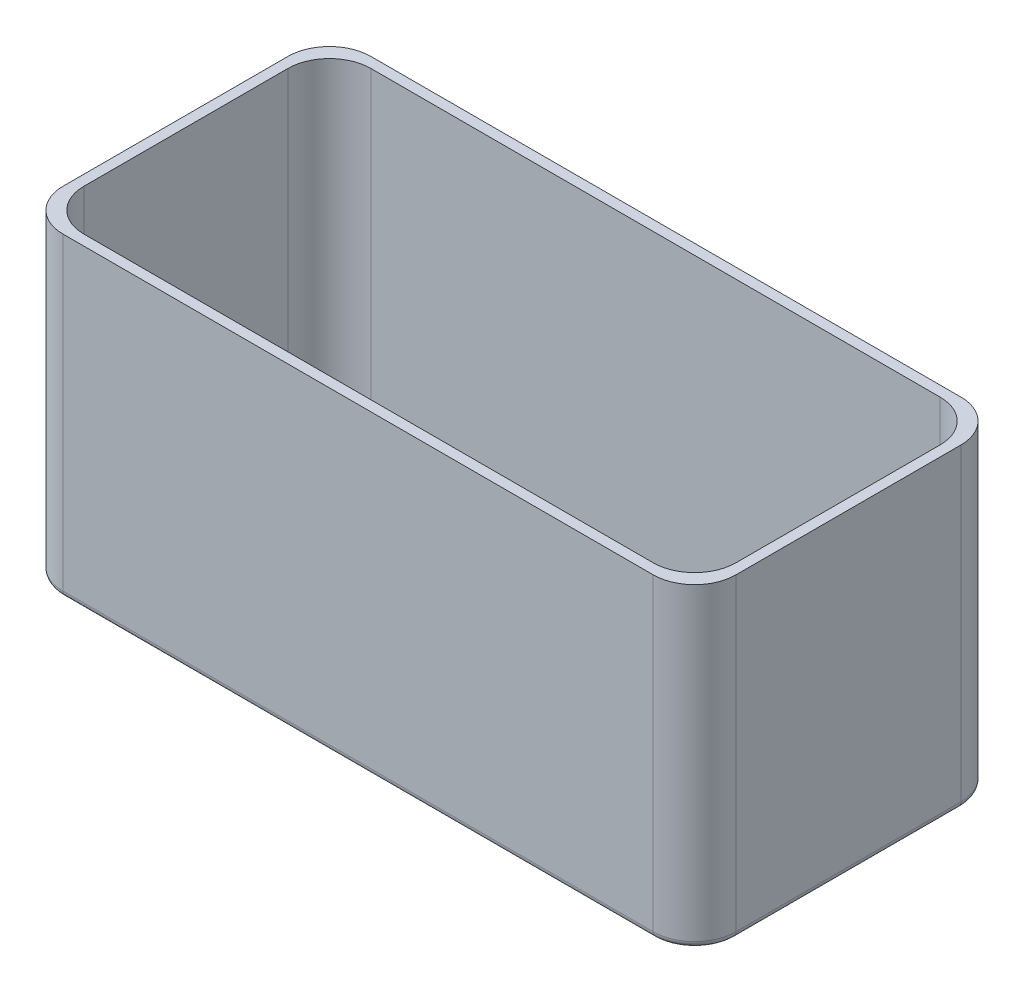
ISO-10303-21;
HEADER;
FILE_DESCRIPTION(('STEP AP214'),'2;1');
FILE_NAME('part.step','',(''),(''),'','','');
FILE_SCHEMA(('AUTOMOTIVE_DESIGN { 1 0 10303 214 1 1 1 1 }'));
ENDSEC;
DATA;
#1=APPLICATION_CONTEXT('core data for automotive mechanical design processes');
#2=APPLICATION_PROTOCOL_DEFINITION('international standard','automotive_design',2000,#1);
#3=PRODUCT_CONTEXT('',#1,'mechanical');
#4=PRODUCT('Part','Part','',(#3));
#5=PRODUCT_RELATED_PRODUCT_CATEGORY('part','',(#4));
#6=PRODUCT_DEFINITION_FORMATION('','',#4);
#7=PRODUCT_DEFINITION_CONTEXT('part definition',#1,'design');
#8=PRODUCT_DEFINITION('design','',#6,#7);
#9=PRODUCT_DEFINITION_SHAPE('','',#8);
#10=(LENGTH_UNIT() NAMED_UNIT(*) SI_UNIT(.MILLI.,.METRE.));
#11=(NAMED_UNIT(*) PLANE_ANGLE_UNIT() SI_UNIT($,.RADIAN.));
#12=(NAMED_UNIT(*) SI_UNIT($,.STERADIAN.) SOLID_ANGLE_UNIT());
#13=UNCERTAINTY_MEASURE_WITH_UNIT(LENGTH_MEASURE(1.E-05),#10,'distance_accuracy_value','');
#14=(GEOMETRIC_REPRESENTATION_CONTEXT(3) GLOBAL_UNCERTAINTY_ASSIGNED_CONTEXT((#13)) GLOBAL_UNIT_ASSIGNED_CONTEXT((#10,
#11,#12)) REPRESENTATION_CONTEXT('',''));
#15=CARTESIAN_POINT('',(0.,0.,0.));
#16=DIRECTION('',(0.,0.,1.));
#17=DIRECTION('',(1.,0.,0.));
#18=AXIS2_PLACEMENT_3D('',#15,#16,#17);
#19=CARTESIAN_POINT('',(0.,24.2,0.));
#20=DIRECTION('',(0.,-1.,0.));
#21=DIRECTION('',(0.,0.,-1.));
#22=AXIS2_PLACEMENT_3D('',#19,#20,#21);
#23=PLANE('',#22);
#24=DIRECTION('',(1.,0.,0.));
#25=VECTOR('',#24,1.);
#26=CARTESIAN_POINT('',(25.8,24.2,11.8));
#27=LINE('',#26,#25);
#28=CARTESIAN_POINT('',(-22.62,24.2,11.8));
#29=VERTEX_POINT('',#28);
#30=CARTESIAN_POINT('',(22.62,24.2,11.8));
#31=VERTEX_POINT('',#30);
#32=EDGE_CURVE('E211',#29,#31,#27,.T.);
#33=ORIENTED_EDGE('',*,*,#32,.T.);
#34=CARTESIAN_POINT('',(22.62,24.2,8.62));
#35=DIRECTION('',(0.,-1.,0.));
#36=DIRECTION('',(0.,0.,-1.));
#37=AXIS2_PLACEMENT_3D('',#34,#35,#36);
#38=CIRCLE('',#37,3.18);
#39=CARTESIAN_POINT('',(25.8,24.2,8.62));
#40=VERTEX_POINT('',#39);
#41=EDGE_CURVE('E205',#31,#40,#38,.F.);
#42=ORIENTED_EDGE('',*,*,#41,.T.);
#43=DIRECTION('',(0.,0.,-1.));
#44=VECTOR('',#43,1.);
#45=CARTESIAN_POINT('',(25.8,24.2,-11.8));
#46=LINE('',#45,#44);
#47=CARTESIAN_POINT('',(25.8,24.2,-8.62));
#48=VERTEX_POINT('',#47);
#49=EDGE_CURVE('E208',#40,#48,#46,.T.);
#50=ORIENTED_EDGE('',*,*,#49,.T.);
#51=CARTESIAN_POINT('',(22.62,24.2,-8.62));
#52=DIRECTION('',(0.,-1.,0.));
#53=DIRECTION('',(0.,0.,-1.));
#54=AXIS2_PLACEMENT_3D('',#51,#52,#53);
#55=CIRCLE('',#54,3.18);
#56=CARTESIAN_POINT('',(22.62,24.2,-11.8));
#57=VERTEX_POINT('',#56);
#58=EDGE_CURVE('E217',#48,#57,#55,.F.);
#59=ORIENTED_EDGE('',*,*,#58,.T.);
#60=DIRECTION('',(-1.,0.,0.));
#61=VECTOR('',#60,1.);
#62=CARTESIAN_POINT('',(25.8,24.2,-11.8));
#63=LINE('',#62,#61);
#64=CARTESIAN_POINT('',(-22.62,24.2,-11.8));
#65=VERTEX_POINT('',#64);
#66=EDGE_CURVE('E227',#57,#65,#63,.T.);
#67=ORIENTED_EDGE('',*,*,#66,.T.);
#68=CARTESIAN_POINT('',(-22.62,24.2,-8.62));
#69=DIRECTION('',(0.,-1.,0.));
#70=DIRECTION('',(0.,0.,-1.));
#71=AXIS2_PLACEMENT_3D('',#68,#69,#70);
#72=CIRCLE('',#71,3.18);
#73=CARTESIAN_POINT('',(-25.8,24.2,-8.62));
#74=VERTEX_POINT('',#73);
#75=EDGE_CURVE('E298',#65,#74,#72,.F.);
#76=ORIENTED_EDGE('',*,*,#75,.T.);
#77=DIRECTION('',(0.,0.,1.));
#78=VECTOR('',#77,1.);
#79=CARTESIAN_POINT('',(-25.8,24.2,-11.8));
#80=LINE('',#79,#78);
#81=CARTESIAN_POINT('',(-25.8,24.2,8.62));
#82=VERTEX_POINT('',#81);
#83=EDGE_CURVE('E493',#74,#82,#80,.T.);
#84=ORIENTED_EDGE('',*,*,#83,.T.);
#85=CARTESIAN_POINT('',(-22.62,24.2,8.62));
#86=DIRECTION('',(0.,-1.,0.));
#87=DIRECTION('',(0.,0.,-1.));
#88=AXIS2_PLACEMENT_3D('',#85,#86,#87);
#89=CIRCLE('',#88,3.18);
#90=EDGE_CURVE('E301',#82,#29,#89,.F.);
#91=ORIENTED_EDGE('',*,*,#90,.T.);
#92=EDGE_LOOP('',(#33,#42,#50,#59,#67,#76,#84,#91));
#93=FACE_BOUND('',#92,.T.);
#94=DIRECTION('',(0.,0.,1.));
#95=VECTOR('',#94,1.);
#96=CARTESIAN_POINT('',(-25.,24.2,-11.));
#97=LINE('',#96,#95);
#98=CARTESIAN_POINT('',(-25.,24.2,-7.81999999999999));
#99=VERTEX_POINT('',#98);
#100=CARTESIAN_POINT('',(-25.,24.2,7.82));
#101=VERTEX_POINT('',#100);
#102=EDGE_CURVE('E428',#99,#101,#97,.T.);
#103=ORIENTED_EDGE('',*,*,#102,.F.);
#104=CARTESIAN_POINT('',(-21.82,24.2,-7.81999999999999));
#105=DIRECTION('',(0.,-1.,0.));
#106=DIRECTION('',(0.,0.,-1.));
#107=AXIS2_PLACEMENT_3D('',#104,#105,#106);
#108=CIRCLE('',#107,3.18);
#109=CARTESIAN_POINT('',(-21.82,24.2,-11.));
#110=VERTEX_POINT('',#109);
#111=EDGE_CURVE('E292',#99,#110,#108,.T.);
#112=ORIENTED_EDGE('',*,*,#111,.T.);
#113=DIRECTION('',(-1.,0.,0.));
#114=VECTOR('',#113,1.);
#115=CARTESIAN_POINT('',(25.,24.2,-11.));
#116=LINE('',#115,#114);
#117=CARTESIAN_POINT('',(21.82,24.2,-11.));
#118=VERTEX_POINT('',#117);
#119=EDGE_CURVE('E228',#118,#110,#116,.T.);
#120=ORIENTED_EDGE('',*,*,#119,.F.);
#121=CARTESIAN_POINT('',(21.82,24.2,-7.82));
#122=DIRECTION('',(0.,-1.,0.));
#123=DIRECTION('',(0.,0.,-1.));
#124=AXIS2_PLACEMENT_3D('',#121,#122,#123);
#125=CIRCLE('',#124,3.18);
#126=CARTESIAN_POINT('',(25.,24.2,-7.82));
#127=VERTEX_POINT('',#126);
#128=EDGE_CURVE('E286',#118,#127,#125,.T.);
#129=ORIENTED_EDGE('',*,*,#128,.T.);
#130=DIRECTION('',(0.,0.,-1.));
#131=VECTOR('',#130,1.);
#132=CARTESIAN_POINT('',(25.,24.2,-11.));
#133=LINE('',#132,#131);
#134=CARTESIAN_POINT('',(25.,24.2,7.81999999999999));
#135=VERTEX_POINT('',#134);
#136=EDGE_CURVE('E478',#135,#127,#133,.T.);
#137=ORIENTED_EDGE('',*,*,#136,.F.);
#138=CARTESIAN_POINT('',(21.82,24.2,7.81999999999999));
#139=DIRECTION('',(0.,-1.,0.));
#140=DIRECTION('',(0.,0.,-1.));
#141=AXIS2_PLACEMENT_3D('',#138,#139,#140);
#142=CIRCLE('',#141,3.18);
#143=CARTESIAN_POINT('',(21.82,24.2,11.));
#144=VERTEX_POINT('',#143);
#145=EDGE_CURVE('E295',#135,#144,#142,.T.);
#146=ORIENTED_EDGE('',*,*,#145,.T.);
#147=DIRECTION('',(1.,0.,0.));
#148=VECTOR('',#147,1.);
#149=CARTESIAN_POINT('',(25.,24.2,11.));
#150=LINE('',#149,#148);
#151=CARTESIAN_POINT('',(-21.82,24.2,11.));
#152=VERTEX_POINT('',#151);
#153=EDGE_CURVE('E475',#152,#144,#150,.T.);
#154=ORIENTED_EDGE('',*,*,#153,.F.);
#155=CARTESIAN_POINT('',(-21.82,24.2,7.82));
#156=DIRECTION('',(0.,-1.,0.));
#157=DIRECTION('',(0.,0.,-1.));
#158=AXIS2_PLACEMENT_3D('',#155,#156,#157);
#159=CIRCLE('',#158,3.18);
#160=EDGE_CURVE('E289',#152,#101,#159,.T.);
#161=ORIENTED_EDGE('',*,*,#160,.T.);
#162=EDGE_LOOP('',(#103,#112,#120,#129,#137,#146,#154,#161));
#163=FACE_BOUND('',#162,.T.);
#164=ADVANCED_FACE('F39',(#93,#163),#23,.F.);
#165=CARTESIAN_POINT('',(0.,0.,0.));
#166=DIRECTION('',(0.,-1.,0.));
#167=DIRECTION('',(0.,0.,-1.));
#168=AXIS2_PLACEMENT_3D('',#165,#166,#167);
#169=PLANE('',#168);
#170=DIRECTION('',(1.,0.,0.));
#171=VECTOR('',#170,1.);
#172=CARTESIAN_POINT('',(-22.62,0.,11.3));
#173=LINE('',#172,#171);
#174=CARTESIAN_POINT('',(22.62,0.,11.3));
#175=VERTEX_POINT('',#174);
#176=CARTESIAN_POINT('',(-22.62,0.,11.3));
#177=VERTEX_POINT('',#176);
#178=EDGE_CURVE('E216',#175,#177,#173,.F.);
#179=ORIENTED_EDGE('',*,*,#178,.T.);
#180=CARTESIAN_POINT('',(-22.62,0.,8.62));
#181=DIRECTION('',(0.,-1.,0.));
#182=DIRECTION('',(0.,0.,-1.));
#183=AXIS2_PLACEMENT_3D('',#180,#181,#182);
#184=CIRCLE('',#183,2.68);
#185=CARTESIAN_POINT('',(-25.3,0.,8.62));
#186=VERTEX_POINT('',#185);
#187=EDGE_CURVE('E326',#177,#186,#184,.T.);
#188=ORIENTED_EDGE('',*,*,#187,.T.);
#189=DIRECTION('',(0.,0.,1.));
#190=VECTOR('',#189,1.);
#191=CARTESIAN_POINT('',(-25.3,0.,-8.62));
#192=LINE('',#191,#190);
#193=CARTESIAN_POINT('',(-25.3,0.,-8.62));
#194=VERTEX_POINT('',#193);
#195=EDGE_CURVE('E323',#186,#194,#192,.F.);
#196=ORIENTED_EDGE('',*,*,#195,.T.);
#197=CARTESIAN_POINT('',(-22.62,0.,-8.62));
#198=DIRECTION('',(0.,-1.,0.));
#199=DIRECTION('',(0.,0.,-1.));
#200=AXIS2_PLACEMENT_3D('',#197,#198,#199);
#201=CIRCLE('',#200,2.68);
#202=CARTESIAN_POINT('',(-22.62,0.,-11.3));
#203=VERTEX_POINT('',#202);
#204=EDGE_CURVE('E320',#194,#203,#201,.T.);
#205=ORIENTED_EDGE('',*,*,#204,.T.);
#206=DIRECTION('',(-1.,0.,0.));
#207=VECTOR('',#206,1.);
#208=CARTESIAN_POINT('',(22.62,0.,-11.3));
#209=LINE('',#208,#207);
#210=CARTESIAN_POINT('',(22.62,0.,-11.3));
#211=VERTEX_POINT('',#210);
#212=EDGE_CURVE('E317',#203,#211,#209,.F.);
#213=ORIENTED_EDGE('',*,*,#212,.T.);
#214=CARTESIAN_POINT('',(22.62,0.,-8.62));
#215=DIRECTION('',(0.,-1.,0.));
#216=DIRECTION('',(0.,0.,-1.));
#217=AXIS2_PLACEMENT_3D('',#214,#215,#216);
#218=CIRCLE('',#217,2.68);
#219=CARTESIAN_POINT('',(25.3,0.,-8.62));
#220=VERTEX_POINT('',#219);
#221=EDGE_CURVE('E314',#211,#220,#218,.T.);
#222=ORIENTED_EDGE('',*,*,#221,.T.);
#223=DIRECTION('',(0.,0.,-1.));
#224=VECTOR('',#223,1.);
#225=CARTESIAN_POINT('',(25.3,0.,8.62));
#226=LINE('',#225,#224);
#227=CARTESIAN_POINT('',(25.3,0.,8.62));
#228=VERTEX_POINT('',#227);
#229=EDGE_CURVE('E311',#220,#228,#226,.F.);
#230=ORIENTED_EDGE('',*,*,#229,.T.);
#231=CARTESIAN_POINT('',(22.62,0.,8.62));
#232=DIRECTION('',(0.,-1.,0.));
#233=DIRECTION('',(0.,0.,-1.));
#234=AXIS2_PLACEMENT_3D('',#231,#232,#233);
#235=CIRCLE('',#234,2.68);
#236=EDGE_CURVE('E308',#228,#175,#235,.T.);
#237=ORIENTED_EDGE('',*,*,#236,.T.);
#238=EDGE_LOOP('',(#179,#188,#196,#205,#213,#222,#230,#237));
#239=FACE_BOUND('',#238,.T.);
#240=ADVANCED_FACE('F521',(#239),#169,.T.);
#241=CARTESIAN_POINT('',(25.8,24.2,-11.8));
#242=DIRECTION('',(-1.,0.,0.));
#243=DIRECTION('',(0.,0.,1.));
#244=AXIS2_PLACEMENT_3D('',#241,#242,#243);
#245=PLANE('',#244);
#246=DIRECTION('',(0.,-1.,0.));
#247=VECTOR('',#246,1.);
#248=CARTESIAN_POINT('',(25.8,24.2,8.62));
#249=LINE('',#248,#247);
#250=CARTESIAN_POINT('',(25.8,0.5,8.62));
#251=VERTEX_POINT('',#250);
#252=EDGE_CURVE('E222',#40,#251,#249,.T.);
#253=ORIENTED_EDGE('',*,*,#252,.T.);
#254=DIRECTION('',(0.,0.,-1.));
#255=VECTOR('',#254,1.);
#256=CARTESIAN_POINT('',(25.8,0.5,-8.62));
#257=LINE('',#256,#255);
#258=CARTESIAN_POINT('',(25.8,0.5,-8.62));
#259=VERTEX_POINT('',#258);
#260=EDGE_CURVE('E346',#251,#259,#257,.T.);
#261=ORIENTED_EDGE('',*,*,#260,.T.);
#262=DIRECTION('',(0.,-1.,0.));
#263=VECTOR('',#262,1.);
#264=CARTESIAN_POINT('',(25.8,24.2,-8.62));
#265=LINE('',#264,#263);
#266=EDGE_CURVE('E225',#259,#48,#265,.F.);
#267=ORIENTED_EDGE('',*,*,#266,.T.);
#268=ORIENTED_EDGE('',*,*,#49,.F.);
#269=EDGE_LOOP('',(#253,#261,#267,#268));
#270=FACE_BOUND('',#269,.T.);
#271=ADVANCED_FACE('F221',(#270),#245,.F.);
#272=CARTESIAN_POINT('',(25.8,24.2,-11.8));
#273=DIRECTION('',(0.,0.,1.));
#274=DIRECTION('',(1.,0.,0.));
#275=AXIS2_PLACEMENT_3D('',#272,#273,#274);
#276=PLANE('',#275);
#277=DIRECTION('',(0.,-1.,0.));
#278=VECTOR('',#277,1.);
#279=CARTESIAN_POINT('',(22.62,24.2,-11.8));
#280=LINE('',#279,#278);
#281=CARTESIAN_POINT('',(22.62,0.5,-11.8));
#282=VERTEX_POINT('',#281);
#283=EDGE_CURVE('E249',#57,#282,#280,.T.);
#284=ORIENTED_EDGE('',*,*,#283,.T.);
#285=DIRECTION('',(-1.,0.,0.));
#286=VECTOR('',#285,1.);
#287=CARTESIAN_POINT('',(-22.62,0.5,-11.8));
#288=LINE('',#287,#286);
#289=CARTESIAN_POINT('',(-22.62,0.5,-11.8));
#290=VERTEX_POINT('',#289);
#291=EDGE_CURVE('E340',#282,#290,#288,.T.);
#292=ORIENTED_EDGE('',*,*,#291,.T.);
#293=DIRECTION('',(0.,-1.,0.));
#294=VECTOR('',#293,1.);
#295=CARTESIAN_POINT('',(-22.62,24.2,-11.8));
#296=LINE('',#295,#294);
#297=EDGE_CURVE('E246',#290,#65,#296,.F.);
#298=ORIENTED_EDGE('',*,*,#297,.T.);
#299=ORIENTED_EDGE('',*,*,#66,.F.);
#300=EDGE_LOOP('',(#284,#292,#298,#299));
#301=FACE_BOUND('',#300,.T.);
#302=ADVANCED_FACE('F542',(#301),#276,.F.);
#303=CARTESIAN_POINT('',(-25.8,24.2,-11.8));
#304=DIRECTION('',(1.,0.,0.));
#305=DIRECTION('',(0.,0.,-1.));
#306=AXIS2_PLACEMENT_3D('',#303,#304,#305);
#307=PLANE('',#306);
#308=DIRECTION('',(0.,-1.,0.));
#309=VECTOR('',#308,1.);
#310=CARTESIAN_POINT('',(-25.8,24.2,-8.62));
#311=LINE('',#310,#309);
#312=CARTESIAN_POINT('',(-25.8,0.5,-8.62));
#313=VERTEX_POINT('',#312);
#314=EDGE_CURVE('E279',#74,#313,#311,.T.);
#315=ORIENTED_EDGE('',*,*,#314,.T.);
#316=DIRECTION('',(0.,0.,1.));
#317=VECTOR('',#316,1.);
#318=CARTESIAN_POINT('',(-25.8,0.5,8.62));
#319=LINE('',#318,#317);
#320=CARTESIAN_POINT('',(-25.8,0.5,8.62));
#321=VERTEX_POINT('',#320);
#322=EDGE_CURVE('E334',#313,#321,#319,.T.);
#323=ORIENTED_EDGE('',*,*,#322,.T.);
#324=DIRECTION('',(0.,-1.,0.));
#325=VECTOR('',#324,1.);
#326=CARTESIAN_POINT('',(-25.8,24.2,8.62));
#327=LINE('',#326,#325);
#328=EDGE_CURVE('E283',#321,#82,#327,.F.);
#329=ORIENTED_EDGE('',*,*,#328,.T.);
#330=ORIENTED_EDGE('',*,*,#83,.F.);
#331=EDGE_LOOP('',(#315,#323,#329,#330));
#332=FACE_BOUND('',#331,.T.);
#333=ADVANCED_FACE('F547',(#332),#307,.F.);
#334=CARTESIAN_POINT('',(25.8,24.2,11.8));
#335=DIRECTION('',(0.,0.,-1.));
#336=DIRECTION('',(-1.,0.,0.));
#337=AXIS2_PLACEMENT_3D('',#334,#335,#336);
#338=PLANE('',#337);
#339=DIRECTION('',(0.,-1.,0.));
#340=VECTOR('',#339,1.);
#341=CARTESIAN_POINT('',(-22.62,24.2,11.8));
#342=LINE('',#341,#340);
#343=CARTESIAN_POINT('',(-22.62,0.5,11.8));
#344=VERTEX_POINT('',#343);
#345=EDGE_CURVE('E234',#29,#344,#342,.T.);
#346=ORIENTED_EDGE('',*,*,#345,.T.);
#347=DIRECTION('',(1.,0.,0.));
#348=VECTOR('',#347,1.);
#349=CARTESIAN_POINT('',(22.62,0.5,11.8));
#350=LINE('',#349,#348);
#351=CARTESIAN_POINT('',(22.62,0.5,11.8));
#352=VERTEX_POINT('',#351);
#353=EDGE_CURVE('E49',#344,#352,#350,.T.);
#354=ORIENTED_EDGE('',*,*,#353,.T.);
#355=DIRECTION('',(0.,-1.,0.));
#356=VECTOR('',#355,1.);
#357=CARTESIAN_POINT('',(22.62,24.2,11.8));
#358=LINE('',#357,#356);
#359=EDGE_CURVE('E239',#352,#31,#358,.F.);
#360=ORIENTED_EDGE('',*,*,#359,.T.);
#361=ORIENTED_EDGE('',*,*,#32,.F.);
#362=EDGE_LOOP('',(#346,#354,#360,#361));
#363=FACE_BOUND('',#362,.T.);
#364=ADVANCED_FACE('F508',(#363),#338,.F.);
#365=CARTESIAN_POINT('',(-25.,24.2,-11.));
#366=DIRECTION('',(1.,0.,0.));
#367=DIRECTION('',(0.,0.,-1.));
#368=AXIS2_PLACEMENT_3D('',#365,#366,#367);
#369=PLANE('',#368);
#370=DIRECTION('',(0.,-1.,0.));
#371=VECTOR('',#370,1.);
#372=CARTESIAN_POINT('',(-25.,0.799999999999999,7.82));
#373=LINE('',#372,#371);
#374=CARTESIAN_POINT('',(-25.,1.3,7.82));
#375=VERTEX_POINT('',#374);
#376=EDGE_CURVE('E270',#101,#375,#373,.T.);
#377=ORIENTED_EDGE('',*,*,#376,.T.);
#378=DIRECTION('',(0.,0.,1.));
#379=VECTOR('',#378,1.);
#380=CARTESIAN_POINT('',(-25.,1.3,-7.81999999999999));
#381=LINE('',#380,#379);
#382=CARTESIAN_POINT('',(-25.,1.3,-7.81999999999999));
#383=VERTEX_POINT('',#382);
#384=EDGE_CURVE('E11',#375,#383,#381,.F.);
#385=ORIENTED_EDGE('',*,*,#384,.T.);
#386=DIRECTION('',(0.,-1.,0.));
#387=VECTOR('',#386,1.);
#388=CARTESIAN_POINT('',(-25.,24.2,-7.81999999999999));
#389=LINE('',#388,#387);
#390=EDGE_CURVE('E267',#383,#99,#389,.F.);
#391=ORIENTED_EDGE('',*,*,#390,.T.);
#392=ORIENTED_EDGE('',*,*,#102,.T.);
#393=EDGE_LOOP('',(#377,#385,#391,#392));
#394=FACE_BOUND('',#393,.T.);
#395=ADVANCED_FACE('F573',(#394),#369,.T.);
#396=CARTESIAN_POINT('',(25.,24.2,11.));
#397=DIRECTION('',(0.,0.,-1.));
#398=DIRECTION('',(-1.,0.,0.));
#399=AXIS2_PLACEMENT_3D('',#396,#397,#398);
#400=PLANE('',#399);
#401=DIRECTION('',(0.,-1.,0.));
#402=VECTOR('',#401,1.);
#403=CARTESIAN_POINT('',(21.82,0.799999999999999,11.));
#404=LINE('',#403,#402);
#405=CARTESIAN_POINT('',(21.82,1.3,11.));
#406=VERTEX_POINT('',#405);
#407=EDGE_CURVE('E273',#144,#406,#404,.T.);
#408=ORIENTED_EDGE('',*,*,#407,.T.);
#409=DIRECTION('',(-1.,0.,0.));
#410=VECTOR('',#409,1.);
#411=CARTESIAN_POINT('',(-21.82,1.3,11.));
#412=LINE('',#411,#410);
#413=CARTESIAN_POINT('',(-21.82,1.3,11.));
#414=VERTEX_POINT('',#413);
#415=EDGE_CURVE('E65',#406,#414,#412,.T.);
#416=ORIENTED_EDGE('',*,*,#415,.T.);
#417=DIRECTION('',(0.,-1.,0.));
#418=VECTOR('',#417,1.);
#419=CARTESIAN_POINT('',(-21.82,24.2,11.));
#420=LINE('',#419,#418);
#421=EDGE_CURVE('E276',#414,#152,#420,.F.);
#422=ORIENTED_EDGE('',*,*,#421,.T.);
#423=ORIENTED_EDGE('',*,*,#153,.T.);
#424=EDGE_LOOP('',(#408,#416,#422,#423));
#425=FACE_BOUND('',#424,.T.);
#426=ADVANCED_FACE('F473',(#425),#400,.T.);
#427=CARTESIAN_POINT('',(25.,24.2,-11.));
#428=DIRECTION('',(-1.,0.,0.));
#429=DIRECTION('',(0.,0.,1.));
#430=AXIS2_PLACEMENT_3D('',#427,#428,#429);
#431=PLANE('',#430);
#432=DIRECTION('',(0.,-1.,0.));
#433=VECTOR('',#432,1.);
#434=CARTESIAN_POINT('',(25.,0.799999999999999,-7.82));
#435=LINE('',#434,#433);
#436=CARTESIAN_POINT('',(25.,1.3,-7.82));
#437=VERTEX_POINT('',#436);
#438=EDGE_CURVE('E256',#127,#437,#435,.T.);
#439=ORIENTED_EDGE('',*,*,#438,.T.);
#440=DIRECTION('',(0.,0.,1.));
#441=VECTOR('',#440,1.);
#442=CARTESIAN_POINT('',(25.,1.3,7.81999999999999));
#443=LINE('',#442,#441);
#444=CARTESIAN_POINT('',(25.,1.3,7.81999999999999));
#445=VERTEX_POINT('',#444);
#446=EDGE_CURVE('E386',#437,#445,#443,.T.);
#447=ORIENTED_EDGE('',*,*,#446,.T.);
#448=DIRECTION('',(0.,-1.,0.));
#449=VECTOR('',#448,1.);
#450=CARTESIAN_POINT('',(25.,24.2,7.81999999999999));
#451=LINE('',#450,#449);
#452=EDGE_CURVE('E253',#445,#135,#451,.F.);
#453=ORIENTED_EDGE('',*,*,#452,.T.);
#454=ORIENTED_EDGE('',*,*,#136,.T.);
#455=EDGE_LOOP('',(#439,#447,#453,#454));
#456=FACE_BOUND('',#455,.T.);
#457=ADVANCED_FACE('F795',(#456),#431,.T.);
#458=CARTESIAN_POINT('',(25.,24.2,-11.));
#459=DIRECTION('',(0.,0.,1.));
#460=DIRECTION('',(1.,0.,0.));
#461=AXIS2_PLACEMENT_3D('',#458,#459,#460);
#462=PLANE('',#461);
#463=DIRECTION('',(0.,-1.,0.));
#464=VECTOR('',#463,1.);
#465=CARTESIAN_POINT('',(-21.82,0.799999999999999,-11.));
#466=LINE('',#465,#464);
#467=CARTESIAN_POINT('',(-21.82,1.3,-11.));
#468=VERTEX_POINT('',#467);
#469=EDGE_CURVE('E260',#110,#468,#466,.T.);
#470=ORIENTED_EDGE('',*,*,#469,.T.);
#471=DIRECTION('',(-1.,0.,0.));
#472=VECTOR('',#471,1.);
#473=CARTESIAN_POINT('',(21.82,1.3,-11.));
#474=LINE('',#473,#472);
#475=CARTESIAN_POINT('',(21.82,1.3,-11.));
#476=VERTEX_POINT('',#475);
#477=EDGE_CURVE('E380',#468,#476,#474,.F.);
#478=ORIENTED_EDGE('',*,*,#477,.T.);
#479=DIRECTION('',(0.,-1.,0.));
#480=VECTOR('',#479,1.);
#481=CARTESIAN_POINT('',(21.82,24.2,-11.));
#482=LINE('',#481,#480);
#483=EDGE_CURVE('E264',#476,#118,#482,.F.);
#484=ORIENTED_EDGE('',*,*,#483,.T.);
#485=ORIENTED_EDGE('',*,*,#119,.T.);
#486=EDGE_LOOP('',(#470,#478,#484,#485));
#487=FACE_BOUND('',#486,.T.);
#488=ADVANCED_FACE('F775',(#487),#462,.T.);
#489=CARTESIAN_POINT('',(0.,0.8,0.));
#490=DIRECTION('',(0.,1.,0.));
#491=DIRECTION('',(0.,0.,1.));
#492=AXIS2_PLACEMENT_3D('',#489,#490,#491);
#493=PLANE('',#492);
#494=DIRECTION('',(-1.,0.,0.));
#495=VECTOR('',#494,1.);
#496=CARTESIAN_POINT('',(-21.82,0.8,-10.5));
#497=LINE('',#496,#495);
#498=CARTESIAN_POINT('',(21.82,0.8,-10.5));
#499=VERTEX_POINT('',#498);
#500=CARTESIAN_POINT('',(-21.82,0.8,-10.5));
#501=VERTEX_POINT('',#500);
#502=EDGE_CURVE('E369',#499,#501,#497,.T.);
#503=ORIENTED_EDGE('',*,*,#502,.T.);
#504=CARTESIAN_POINT('',(-21.82,0.8,-7.81999999999999));
#505=DIRECTION('',(0.,1.,0.));
#506=DIRECTION('',(0.,0.,1.));
#507=AXIS2_PLACEMENT_3D('',#504,#505,#506);
#508=CIRCLE('',#507,2.68);
#509=CARTESIAN_POINT('',(-24.5,0.8,-7.81999999999999));
#510=VERTEX_POINT('',#509);
#511=EDGE_CURVE('E372',#501,#510,#508,.T.);
#512=ORIENTED_EDGE('',*,*,#511,.T.);
#513=DIRECTION('',(0.,0.,1.));
#514=VECTOR('',#513,1.);
#515=CARTESIAN_POINT('',(-24.5,0.8,7.82));
#516=LINE('',#515,#514);
#517=CARTESIAN_POINT('',(-24.5,0.8,7.82));
#518=VERTEX_POINT('',#517);
#519=EDGE_CURVE('E351',#510,#518,#516,.T.);
#520=ORIENTED_EDGE('',*,*,#519,.T.);
#521=CARTESIAN_POINT('',(-21.82,0.8,7.82));
#522=DIRECTION('',(0.,1.,0.));
#523=DIRECTION('',(0.,0.,1.));
#524=AXIS2_PLACEMENT_3D('',#521,#522,#523);
#525=CIRCLE('',#524,2.68);
#526=CARTESIAN_POINT('',(-21.82,0.8,10.5));
#527=VERTEX_POINT('',#526);
#528=EDGE_CURVE('E354',#518,#527,#525,.T.);
#529=ORIENTED_EDGE('',*,*,#528,.T.);
#530=DIRECTION('',(-1.,0.,0.));
#531=VECTOR('',#530,1.);
#532=CARTESIAN_POINT('',(21.82,0.8,10.5));
#533=LINE('',#532,#531);
#534=CARTESIAN_POINT('',(21.82,0.8,10.5));
#535=VERTEX_POINT('',#534);
#536=EDGE_CURVE('E357',#527,#535,#533,.F.);
#537=ORIENTED_EDGE('',*,*,#536,.T.);
#538=CARTESIAN_POINT('',(21.82,0.8,7.81999999999999));
#539=DIRECTION('',(0.,1.,0.));
#540=DIRECTION('',(0.,0.,1.));
#541=AXIS2_PLACEMENT_3D('',#538,#539,#540);
#542=CIRCLE('',#541,2.68);
#543=CARTESIAN_POINT('',(24.5,0.8,7.81999999999999));
#544=VERTEX_POINT('',#543);
#545=EDGE_CURVE('E360',#535,#544,#542,.T.);
#546=ORIENTED_EDGE('',*,*,#545,.T.);
#547=DIRECTION('',(0.,0.,1.));
#548=VECTOR('',#547,1.);
#549=CARTESIAN_POINT('',(24.5,0.8,-7.82));
#550=LINE('',#549,#548);
#551=CARTESIAN_POINT('',(24.5,0.8,-7.82));
#552=VERTEX_POINT('',#551);
#553=EDGE_CURVE('E363',#544,#552,#550,.F.);
#554=ORIENTED_EDGE('',*,*,#553,.T.);
#555=CARTESIAN_POINT('',(21.82,0.8,-7.82));
#556=DIRECTION('',(0.,1.,0.));
#557=DIRECTION('',(0.,0.,1.));
#558=AXIS2_PLACEMENT_3D('',#555,#556,#557);
#559=CIRCLE('',#558,2.68);
#560=EDGE_CURVE('E366',#552,#499,#559,.T.);
#561=ORIENTED_EDGE('',*,*,#560,.T.);
#562=EDGE_LOOP('',(#503,#512,#520,#529,#537,#546,#554,#561));
#563=FACE_BOUND('',#562,.T.);
#564=ADVANCED_FACE('F586',(#563),#493,.T.);
#565=CARTESIAN_POINT('',(22.62,24.2,8.62));
#566=DIRECTION('',(0.,-1.,0.));
#567=DIRECTION('',(0.,0.,-1.));
#568=AXIS2_PLACEMENT_3D('',#565,#566,#567);
#569=CYLINDRICAL_SURFACE('',#568,3.18);
#570=ORIENTED_EDGE('',*,*,#359,.F.);
#571=CARTESIAN_POINT('',(22.62,0.5,8.62));
#572=DIRECTION('',(0.,-1.,0.));
#573=DIRECTION('',(0.,0.,-1.));
#574=AXIS2_PLACEMENT_3D('',#571,#572,#573);
#575=CIRCLE('',#574,3.18);
#576=EDGE_CURVE('E232',#352,#251,#575,.F.);
#577=ORIENTED_EDGE('',*,*,#576,.T.);
#578=ORIENTED_EDGE('',*,*,#252,.F.);
#579=ORIENTED_EDGE('',*,*,#41,.F.);
#580=EDGE_LOOP('',(#570,#577,#578,#579));
#581=FACE_BOUND('',#580,.T.);
#582=ADVANCED_FACE('F230',(#581),#569,.T.);
#583=CARTESIAN_POINT('',(22.62,24.2,-8.62));
#584=DIRECTION('',(0.,-1.,0.));
#585=DIRECTION('',(0.,0.,-1.));
#586=AXIS2_PLACEMENT_3D('',#583,#584,#585);
#587=CYLINDRICAL_SURFACE('',#586,3.18);
#588=ORIENTED_EDGE('',*,*,#266,.F.);
#589=CARTESIAN_POINT('',(22.62,0.5,-8.62));
#590=DIRECTION('',(0.,-1.,0.));
#591=DIRECTION('',(0.,0.,-1.));
#592=AXIS2_PLACEMENT_3D('',#589,#590,#591);
#593=CIRCLE('',#592,3.18);
#594=EDGE_CURVE('E343',#259,#282,#593,.F.);
#595=ORIENTED_EDGE('',*,*,#594,.T.);
#596=ORIENTED_EDGE('',*,*,#283,.F.);
#597=ORIENTED_EDGE('',*,*,#58,.F.);
#598=EDGE_LOOP('',(#588,#595,#596,#597));
#599=FACE_BOUND('',#598,.T.);
#600=ADVANCED_FACE('F529',(#599),#587,.T.);
#601=CARTESIAN_POINT('',(21.82,24.2,-7.82));
#602=DIRECTION('',(0.,1.,0.));
#603=DIRECTION('',(0.,0.,1.));
#604=AXIS2_PLACEMENT_3D('',#601,#602,#603);
#605=CYLINDRICAL_SURFACE('',#604,3.18);
#606=ORIENTED_EDGE('',*,*,#483,.F.);
#607=CARTESIAN_POINT('',(21.82,1.3,-7.82));
#608=DIRECTION('',(0.,1.,0.));
#609=DIRECTION('',(0.,0.,1.));
#610=AXIS2_PLACEMENT_3D('',#607,#608,#609);
#611=CIRCLE('',#610,3.18);
#612=EDGE_CURVE('E383',#476,#437,#611,.F.);
#613=ORIENTED_EDGE('',*,*,#612,.T.);
#614=ORIENTED_EDGE('',*,*,#438,.F.);
#615=ORIENTED_EDGE('',*,*,#128,.F.);
#616=EDGE_LOOP('',(#606,#613,#614,#615));
#617=FACE_BOUND('',#616,.T.);
#618=ADVANCED_FACE('F589',(#617),#605,.F.);
#619=CARTESIAN_POINT('',(-21.82,24.2,7.82));
#620=DIRECTION('',(0.,1.,0.));
#621=DIRECTION('',(0.,0.,1.));
#622=AXIS2_PLACEMENT_3D('',#619,#620,#621);
#623=CYLINDRICAL_SURFACE('',#622,3.18);
#624=ORIENTED_EDGE('',*,*,#421,.F.);
#625=CARTESIAN_POINT('',(-21.82,1.3,7.82));
#626=DIRECTION('',(0.,1.,0.));
#627=DIRECTION('',(0.,0.,1.));
#628=AXIS2_PLACEMENT_3D('',#625,#626,#627);
#629=CIRCLE('',#628,3.18);
#630=EDGE_CURVE('E57',#414,#375,#629,.F.);
#631=ORIENTED_EDGE('',*,*,#630,.T.);
#632=ORIENTED_EDGE('',*,*,#376,.F.);
#633=ORIENTED_EDGE('',*,*,#160,.F.);
#634=EDGE_LOOP('',(#624,#631,#632,#633));
#635=FACE_BOUND('',#634,.T.);
#636=ADVANCED_FACE('F592',(#635),#623,.F.);
#637=CARTESIAN_POINT('',(-21.82,24.2,-7.81999999999999));
#638=DIRECTION('',(0.,1.,0.));
#639=DIRECTION('',(0.,0.,1.));
#640=AXIS2_PLACEMENT_3D('',#637,#638,#639);
#641=CYLINDRICAL_SURFACE('',#640,3.18);
#642=ORIENTED_EDGE('',*,*,#390,.F.);
#643=CARTESIAN_POINT('',(-21.82,1.3,-7.81999999999999));
#644=DIRECTION('',(0.,1.,0.));
#645=DIRECTION('',(0.,0.,1.));
#646=AXIS2_PLACEMENT_3D('',#643,#644,#645);
#647=CIRCLE('',#646,3.18);
#648=EDGE_CURVE('E376',#383,#468,#647,.F.);
#649=ORIENTED_EDGE('',*,*,#648,.T.);
#650=ORIENTED_EDGE('',*,*,#469,.F.);
#651=ORIENTED_EDGE('',*,*,#111,.F.);
#652=EDGE_LOOP('',(#642,#649,#650,#651));
#653=FACE_BOUND('',#652,.T.);
#654=ADVANCED_FACE('F596',(#653),#641,.F.);
#655=CARTESIAN_POINT('',(21.82,24.2,7.81999999999999));
#656=DIRECTION('',(0.,1.,0.));
#657=DIRECTION('',(0.,0.,1.));
#658=AXIS2_PLACEMENT_3D('',#655,#656,#657);
#659=CYLINDRICAL_SURFACE('',#658,3.18);
#660=ORIENTED_EDGE('',*,*,#452,.F.);
#661=CARTESIAN_POINT('',(21.82,1.3,7.81999999999999));
#662=DIRECTION('',(0.,1.,0.));
#663=DIRECTION('',(0.,0.,1.));
#664=AXIS2_PLACEMENT_3D('',#661,#662,#663);
#665=CIRCLE('',#664,3.18);
#666=EDGE_CURVE('E389',#445,#406,#665,.F.);
#667=ORIENTED_EDGE('',*,*,#666,.T.);
#668=ORIENTED_EDGE('',*,*,#407,.F.);
#669=ORIENTED_EDGE('',*,*,#145,.F.);
#670=EDGE_LOOP('',(#660,#667,#668,#669));
#671=FACE_BOUND('',#670,.T.);
#672=ADVANCED_FACE('F470',(#671),#659,.F.);
#673=CARTESIAN_POINT('',(-22.62,24.2,8.62));
#674=DIRECTION('',(0.,-1.,0.));
#675=DIRECTION('',(0.,0.,-1.));
#676=AXIS2_PLACEMENT_3D('',#673,#674,#675);
#677=CYLINDRICAL_SURFACE('',#676,3.18);
#678=ORIENTED_EDGE('',*,*,#328,.F.);
#679=CARTESIAN_POINT('',(-22.62,0.5,8.62));
#680=DIRECTION('',(0.,-1.,0.));
#681=DIRECTION('',(0.,0.,-1.));
#682=AXIS2_PLACEMENT_3D('',#679,#680,#681);
#683=CIRCLE('',#682,3.18);
#684=EDGE_CURVE('E330',#321,#344,#683,.F.);
#685=ORIENTED_EDGE('',*,*,#684,.T.);
#686=ORIENTED_EDGE('',*,*,#345,.F.);
#687=ORIENTED_EDGE('',*,*,#90,.F.);
#688=EDGE_LOOP('',(#678,#685,#686,#687));
#689=FACE_BOUND('',#688,.T.);
#690=ADVANCED_FACE('F505',(#689),#677,.T.);
#691=CARTESIAN_POINT('',(-22.62,24.2,-8.62));
#692=DIRECTION('',(0.,-1.,0.));
#693=DIRECTION('',(0.,0.,-1.));
#694=AXIS2_PLACEMENT_3D('',#691,#692,#693);
#695=CYLINDRICAL_SURFACE('',#694,3.18);
#696=ORIENTED_EDGE('',*,*,#297,.F.);
#697=CARTESIAN_POINT('',(-22.62,0.5,-8.62));
#698=DIRECTION('',(0.,-1.,0.));
#699=DIRECTION('',(0.,0.,-1.));
#700=AXIS2_PLACEMENT_3D('',#697,#698,#699);
#701=CIRCLE('',#700,3.18);
#702=EDGE_CURVE('E337',#290,#313,#701,.F.);
#703=ORIENTED_EDGE('',*,*,#702,.T.);
#704=ORIENTED_EDGE('',*,*,#314,.F.);
#705=ORIENTED_EDGE('',*,*,#75,.F.);
#706=EDGE_LOOP('',(#696,#703,#704,#705));
#707=FACE_BOUND('',#706,.T.);
#708=ADVANCED_FACE('F545',(#707),#695,.T.);
#709=CARTESIAN_POINT('',(22.62,0.5,-8.62));
#710=DIRECTION('',(0.,-1.,0.));
#711=DIRECTION('',(0.,0.,-1.));
#712=AXIS2_PLACEMENT_3D('',#709,#710,#711);
#713=TOROIDAL_SURFACE('',#712,2.68,0.5);
#714=CARTESIAN_POINT('',(22.62,0.5,-11.3));
#715=DIRECTION('',(-1.,0.,0.));
#716=DIRECTION('',(0.,0.,1.));
#717=AXIS2_PLACEMENT_3D('',#714,#715,#716);
#718=CIRCLE('',#717,0.5);
#719=EDGE_CURVE('E420',#282,#211,#718,.T.);
#720=ORIENTED_EDGE('',*,*,#719,.F.);
#721=ORIENTED_EDGE('',*,*,#594,.F.);
#722=CARTESIAN_POINT('',(25.3,0.5,-8.62));
#723=DIRECTION('',(0.,0.,1.));
#724=DIRECTION('',(1.,0.,0.));
#725=AXIS2_PLACEMENT_3D('',#722,#723,#724);
#726=CIRCLE('',#725,0.5);
#727=EDGE_CURVE('E424',#220,#259,#726,.T.);
#728=ORIENTED_EDGE('',*,*,#727,.F.);
#729=ORIENTED_EDGE('',*,*,#221,.F.);
#730=EDGE_LOOP('',(#720,#721,#728,#729));
#731=FACE_BOUND('',#730,.T.);
#732=ADVANCED_FACE('F533',(#731),#713,.T.);
#733=CARTESIAN_POINT('',(25.3,0.5,-11.8));
#734=DIRECTION('',(0.,0.,1.));
#735=DIRECTION('',(1.,0.,0.));
#736=AXIS2_PLACEMENT_3D('',#733,#734,#735);
#737=CYLINDRICAL_SURFACE('',#736,0.5);
#738=ORIENTED_EDGE('',*,*,#727,.T.);
#739=ORIENTED_EDGE('',*,*,#260,.F.);
#740=CARTESIAN_POINT('',(25.3,0.5,8.62));
#741=DIRECTION('',(0.,0.,1.));
#742=DIRECTION('',(1.,0.,0.));
#743=AXIS2_PLACEMENT_3D('',#740,#741,#742);
#744=CIRCLE('',#743,0.5);
#745=EDGE_CURVE('E416',#228,#251,#744,.T.);
#746=ORIENTED_EDGE('',*,*,#745,.F.);
#747=ORIENTED_EDGE('',*,*,#229,.F.);
#748=EDGE_LOOP('',(#738,#739,#746,#747));
#749=FACE_BOUND('',#748,.T.);
#750=ADVANCED_FACE('F526',(#749),#737,.T.);
#751=CARTESIAN_POINT('',(25.8,0.5,-11.3));
#752=DIRECTION('',(1.,0.,0.));
#753=DIRECTION('',(0.,0.,-1.));
#754=AXIS2_PLACEMENT_3D('',#751,#752,#753);
#755=CYLINDRICAL_SURFACE('',#754,0.5);
#756=ORIENTED_EDGE('',*,*,#719,.T.);
#757=ORIENTED_EDGE('',*,*,#212,.F.);
#758=CARTESIAN_POINT('',(-22.62,0.5,-11.3));
#759=DIRECTION('',(-1.,0.,0.));
#760=DIRECTION('',(0.,0.,1.));
#761=AXIS2_PLACEMENT_3D('',#758,#759,#760);
#762=CIRCLE('',#761,0.5);
#763=EDGE_CURVE('E412',#290,#203,#762,.T.);
#764=ORIENTED_EDGE('',*,*,#763,.F.);
#765=ORIENTED_EDGE('',*,*,#291,.F.);
#766=EDGE_LOOP('',(#756,#757,#764,#765));
#767=FACE_BOUND('',#766,.T.);
#768=ADVANCED_FACE('F538',(#767),#755,.T.);
#769=CARTESIAN_POINT('',(22.62,0.5,8.62));
#770=DIRECTION('',(0.,-1.,0.));
#771=DIRECTION('',(0.,0.,-1.));
#772=AXIS2_PLACEMENT_3D('',#769,#770,#771);
#773=TOROIDAL_SURFACE('',#772,2.68,0.5);
#774=ORIENTED_EDGE('',*,*,#745,.T.);
#775=ORIENTED_EDGE('',*,*,#576,.F.);
#776=CARTESIAN_POINT('',(22.62,0.5,11.3));
#777=DIRECTION('',(-1.,0.,0.));
#778=DIRECTION('',(0.,0.,1.));
#779=AXIS2_PLACEMENT_3D('',#776,#777,#778);
#780=CIRCLE('',#779,0.5);
#781=EDGE_CURVE('E408',#175,#352,#780,.T.);
#782=ORIENTED_EDGE('',*,*,#781,.F.);
#783=ORIENTED_EDGE('',*,*,#236,.F.);
#784=EDGE_LOOP('',(#774,#775,#782,#783));
#785=FACE_BOUND('',#784,.T.);
#786=ADVANCED_FACE('F512',(#785),#773,.T.);
#787=CARTESIAN_POINT('',(-22.62,0.5,-8.62));
#788=DIRECTION('',(0.,-1.,0.));
#789=DIRECTION('',(0.,0.,-1.));
#790=AXIS2_PLACEMENT_3D('',#787,#788,#789);
#791=TOROIDAL_SURFACE('',#790,2.68,0.5);
#792=ORIENTED_EDGE('',*,*,#763,.T.);
#793=ORIENTED_EDGE('',*,*,#204,.F.);
#794=CARTESIAN_POINT('',(-25.3,0.5,-8.62));
#795=DIRECTION('',(0.,0.,1.));
#796=DIRECTION('',(1.,0.,0.));
#797=AXIS2_PLACEMENT_3D('',#794,#795,#796);
#798=CIRCLE('',#797,0.5);
#799=EDGE_CURVE('E404',#313,#194,#798,.T.);
#800=ORIENTED_EDGE('',*,*,#799,.F.);
#801=ORIENTED_EDGE('',*,*,#702,.F.);
#802=EDGE_LOOP('',(#792,#793,#800,#801));
#803=FACE_BOUND('',#802,.T.);
#804=ADVANCED_FACE('F551',(#803),#791,.T.);
#805=CARTESIAN_POINT('',(25.8,0.5,11.3));
#806=DIRECTION('',(-1.,0.,0.));
#807=DIRECTION('',(0.,0.,1.));
#808=AXIS2_PLACEMENT_3D('',#805,#806,#807);
#809=CYLINDRICAL_SURFACE('',#808,0.5);
#810=ORIENTED_EDGE('',*,*,#781,.T.);
#811=ORIENTED_EDGE('',*,*,#353,.F.);
#812=CARTESIAN_POINT('',(-22.62,0.5,11.3));
#813=DIRECTION('',(-1.,0.,0.));
#814=DIRECTION('',(0.,0.,1.));
#815=AXIS2_PLACEMENT_3D('',#812,#813,#814);
#816=CIRCLE('',#815,0.5);
#817=EDGE_CURVE('E401',#177,#344,#816,.T.);
#818=ORIENTED_EDGE('',*,*,#817,.F.);
#819=ORIENTED_EDGE('',*,*,#178,.F.);
#820=EDGE_LOOP('',(#810,#811,#818,#819));
#821=FACE_BOUND('',#820,.T.);
#822=ADVANCED_FACE('F517',(#821),#809,.T.);
#823=CARTESIAN_POINT('',(-25.3,0.5,-11.8));
#824=DIRECTION('',(0.,0.,-1.));
#825=DIRECTION('',(-1.,0.,0.));
#826=AXIS2_PLACEMENT_3D('',#823,#824,#825);
#827=CYLINDRICAL_SURFACE('',#826,0.5);
#828=ORIENTED_EDGE('',*,*,#799,.T.);
#829=ORIENTED_EDGE('',*,*,#195,.F.);
#830=CARTESIAN_POINT('',(-25.3,0.5,8.62));
#831=DIRECTION('',(0.,0.,1.));
#832=DIRECTION('',(1.,0.,0.));
#833=AXIS2_PLACEMENT_3D('',#830,#831,#832);
#834=CIRCLE('',#833,0.5);
#835=EDGE_CURVE('E398',#321,#186,#834,.T.);
#836=ORIENTED_EDGE('',*,*,#835,.F.);
#837=ORIENTED_EDGE('',*,*,#322,.F.);
#838=EDGE_LOOP('',(#828,#829,#836,#837));
#839=FACE_BOUND('',#838,.T.);
#840=ADVANCED_FACE('F555',(#839),#827,.T.);
#841=CARTESIAN_POINT('',(-22.62,0.5,8.62));
#842=DIRECTION('',(0.,-1.,0.));
#843=DIRECTION('',(0.,0.,-1.));
#844=AXIS2_PLACEMENT_3D('',#841,#842,#843);
#845=TOROIDAL_SURFACE('',#844,2.68,0.5);
#846=ORIENTED_EDGE('',*,*,#817,.T.);
#847=ORIENTED_EDGE('',*,*,#684,.F.);
#848=ORIENTED_EDGE('',*,*,#835,.T.);
#849=ORIENTED_EDGE('',*,*,#187,.F.);
#850=EDGE_LOOP('',(#846,#847,#848,#849));
#851=FACE_BOUND('',#850,.T.);
#852=ADVANCED_FACE('F557',(#851),#845,.T.);
#853=CARTESIAN_POINT('',(21.82,1.3,7.81999999999999));
#854=DIRECTION('',(0.,1.,0.));
#855=DIRECTION('',(0.,0.,1.));
#856=AXIS2_PLACEMENT_3D('',#853,#854,#855);
#857=TOROIDAL_SURFACE('',#856,2.68,0.5);
#858=CARTESIAN_POINT('',(21.82,1.3,10.5));
#859=DIRECTION('',(1.,0.,0.));
#860=DIRECTION('',(0.,0.,-1.));
#861=AXIS2_PLACEMENT_3D('',#858,#859,#860);
#862=CIRCLE('',#861,0.5);
#863=EDGE_CURVE('E450',#406,#535,#862,.T.);
#864=ORIENTED_EDGE('',*,*,#863,.F.);
#865=ORIENTED_EDGE('',*,*,#666,.F.);
#866=CARTESIAN_POINT('',(24.5,1.3,7.81999999999999));
#867=DIRECTION('',(0.,0.,1.));
#868=DIRECTION('',(1.,0.,0.));
#869=AXIS2_PLACEMENT_3D('',#866,#867,#868);
#870=CIRCLE('',#869,0.5);
#871=EDGE_CURVE('E43',#544,#445,#870,.T.);
#872=ORIENTED_EDGE('',*,*,#871,.F.);
#873=ORIENTED_EDGE('',*,*,#545,.F.);
#874=EDGE_LOOP('',(#864,#865,#872,#873));
#875=FACE_BOUND('',#874,.T.);
#876=ADVANCED_FACE('F41',(#875),#857,.F.);
#877=CARTESIAN_POINT('',(24.5,1.3,-11.));
#878=DIRECTION('',(0.,0.,-1.));
#879=DIRECTION('',(-1.,0.,0.));
#880=AXIS2_PLACEMENT_3D('',#877,#878,#879);
#881=CYLINDRICAL_SURFACE('',#880,0.5);
#882=ORIENTED_EDGE('',*,*,#871,.T.);
#883=ORIENTED_EDGE('',*,*,#446,.F.);
#884=CARTESIAN_POINT('',(24.5,1.3,-7.82));
#885=DIRECTION('',(0.,0.,1.));
#886=DIRECTION('',(1.,0.,0.));
#887=AXIS2_PLACEMENT_3D('',#884,#885,#886);
#888=CIRCLE('',#887,0.5);
#889=EDGE_CURVE('E447',#552,#437,#888,.T.);
#890=ORIENTED_EDGE('',*,*,#889,.F.);
#891=ORIENTED_EDGE('',*,*,#553,.F.);
#892=EDGE_LOOP('',(#882,#883,#890,#891));
#893=FACE_BOUND('',#892,.T.);
#894=ADVANCED_FACE('F462',(#893),#881,.F.);
#895=CARTESIAN_POINT('',(25.,1.3,10.5));
#896=DIRECTION('',(1.,0.,0.));
#897=DIRECTION('',(0.,0.,-1.));
#898=AXIS2_PLACEMENT_3D('',#895,#896,#897);
#899=CYLINDRICAL_SURFACE('',#898,0.5);
#900=ORIENTED_EDGE('',*,*,#863,.T.);
#901=ORIENTED_EDGE('',*,*,#536,.F.);
#902=CARTESIAN_POINT('',(-21.82,1.3,10.5));
#903=DIRECTION('',(1.,0.,0.));
#904=DIRECTION('',(0.,0.,-1.));
#905=AXIS2_PLACEMENT_3D('',#902,#903,#904);
#906=CIRCLE('',#905,0.5);
#907=EDGE_CURVE('E443',#414,#527,#906,.T.);
#908=ORIENTED_EDGE('',*,*,#907,.F.);
#909=ORIENTED_EDGE('',*,*,#415,.F.);
#910=EDGE_LOOP('',(#900,#901,#908,#909));
#911=FACE_BOUND('',#910,.T.);
#912=ADVANCED_FACE('F633',(#911),#899,.F.);
#913=CARTESIAN_POINT('',(21.82,1.3,-7.82));
#914=DIRECTION('',(0.,1.,0.));
#915=DIRECTION('',(0.,0.,1.));
#916=AXIS2_PLACEMENT_3D('',#913,#914,#915);
#917=TOROIDAL_SURFACE('',#916,2.68,0.5);
#918=ORIENTED_EDGE('',*,*,#889,.T.);
#919=ORIENTED_EDGE('',*,*,#612,.F.);
#920=CARTESIAN_POINT('',(21.82,1.3,-10.5));
#921=DIRECTION('',(1.,0.,0.));
#922=DIRECTION('',(0.,0.,-1.));
#923=AXIS2_PLACEMENT_3D('',#920,#921,#922);
#924=CIRCLE('',#923,0.5);
#925=EDGE_CURVE('E439',#499,#476,#924,.T.);
#926=ORIENTED_EDGE('',*,*,#925,.F.);
#927=ORIENTED_EDGE('',*,*,#560,.F.);
#928=EDGE_LOOP('',(#918,#919,#926,#927));
#929=FACE_BOUND('',#928,.T.);
#930=ADVANCED_FACE('F629',(#929),#917,.F.);
#931=CARTESIAN_POINT('',(-21.82,1.3,7.82));
#932=DIRECTION('',(0.,1.,0.));
#933=DIRECTION('',(0.,0.,1.));
#934=AXIS2_PLACEMENT_3D('',#931,#932,#933);
#935=TOROIDAL_SURFACE('',#934,2.68,0.5);
#936=ORIENTED_EDGE('',*,*,#907,.T.);
#937=ORIENTED_EDGE('',*,*,#528,.F.);
#938=CARTESIAN_POINT('',(-24.5,1.3,7.82));
#939=DIRECTION('',(0.,0.,1.));
#940=DIRECTION('',(1.,0.,0.));
#941=AXIS2_PLACEMENT_3D('',#938,#939,#940);
#942=CIRCLE('',#941,0.5);
#943=EDGE_CURVE('E435',#375,#518,#942,.T.);
#944=ORIENTED_EDGE('',*,*,#943,.F.);
#945=ORIENTED_EDGE('',*,*,#630,.F.);
#946=EDGE_LOOP('',(#936,#937,#944,#945));
#947=FACE_BOUND('',#946,.T.);
#948=ADVANCED_FACE('F625',(#947),#935,.F.);
#949=CARTESIAN_POINT('',(0.,1.3,-10.5));
#950=DIRECTION('',(1.,0.,0.));
#951=DIRECTION('',(0.,0.,-1.));
#952=AXIS2_PLACEMENT_3D('',#949,#950,#951);
#953=CYLINDRICAL_SURFACE('',#952,0.5);
#954=ORIENTED_EDGE('',*,*,#925,.T.);
#955=ORIENTED_EDGE('',*,*,#477,.F.);
#956=CARTESIAN_POINT('',(-21.82,1.3,-10.5));
#957=DIRECTION('',(1.,0.,0.));
#958=DIRECTION('',(0.,0.,-1.));
#959=AXIS2_PLACEMENT_3D('',#956,#957,#958);
#960=CIRCLE('',#959,0.5);
#961=EDGE_CURVE('E432',#501,#468,#960,.T.);
#962=ORIENTED_EDGE('',*,*,#961,.F.);
#963=ORIENTED_EDGE('',*,*,#502,.F.);
#964=EDGE_LOOP('',(#954,#955,#962,#963));
#965=FACE_BOUND('',#964,.T.);
#966=ADVANCED_FACE('F621',(#965),#953,.F.);
#967=CARTESIAN_POINT('',(-24.5,1.3,0.));
#968=DIRECTION('',(0.,0.,-1.));
#969=DIRECTION('',(-1.,0.,0.));
#970=AXIS2_PLACEMENT_3D('',#967,#968,#969);
#971=CYLINDRICAL_SURFACE('',#970,0.5);
#972=ORIENTED_EDGE('',*,*,#943,.T.);
#973=ORIENTED_EDGE('',*,*,#519,.F.);
#974=CARTESIAN_POINT('',(-24.5,1.3,-7.81999999999999));
#975=DIRECTION('',(0.,0.,1.));
#976=DIRECTION('',(1.,0.,0.));
#977=AXIS2_PLACEMENT_3D('',#974,#975,#976);
#978=CIRCLE('',#977,0.5);
#979=EDGE_CURVE('E429',#383,#510,#978,.T.);
#980=ORIENTED_EDGE('',*,*,#979,.F.);
#981=ORIENTED_EDGE('',*,*,#384,.F.);
#982=EDGE_LOOP('',(#972,#973,#980,#981));
#983=FACE_BOUND('',#982,.T.);
#984=ADVANCED_FACE('F617',(#983),#971,.F.);
#985=CARTESIAN_POINT('',(-21.82,1.3,-7.81999999999999));
#986=DIRECTION('',(0.,1.,0.));
#987=DIRECTION('',(0.,0.,1.));
#988=AXIS2_PLACEMENT_3D('',#985,#986,#987);
#989=TOROIDAL_SURFACE('',#988,2.68,0.5);
#990=ORIENTED_EDGE('',*,*,#961,.T.);
#991=ORIENTED_EDGE('',*,*,#648,.F.);
#992=ORIENTED_EDGE('',*,*,#979,.T.);
#993=ORIENTED_EDGE('',*,*,#511,.F.);
#994=EDGE_LOOP('',(#990,#991,#992,#993));
#995=FACE_BOUND('',#994,.T.);
#996=ADVANCED_FACE('F614',(#995),#989,.F.);
#997=CLOSED_SHELL('',(#164,#240,#271,#302,#333,#364,#395,#426,#457,#488,#564,#582,#600,#618,
#636,#654,#672,#690,#708,#732,#750,#768,#786,#804,#822,#840,#852,#876,#894,#912,#930,#948,#966,
#984,#996));
#998=MANIFOLD_SOLID_BREP('B2',#997);
#999=ADVANCED_BREP_SHAPE_REPRESENTATION('',(#18,#998),#14);
#1000=SHAPE_DEFINITION_REPRESENTATION(#9,#999);
ENDSEC;
END-ISO-10303-21;
